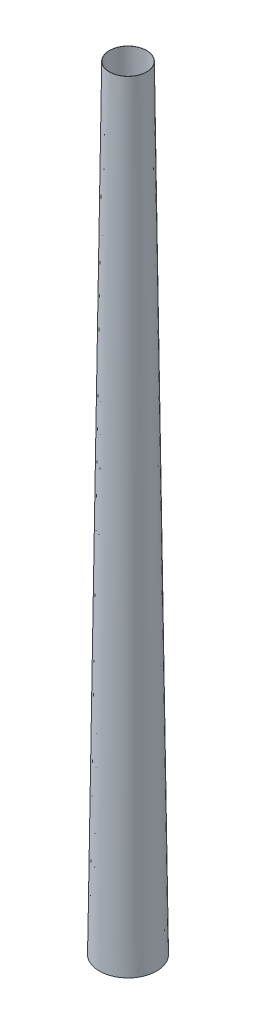
ISO-10303-21;
HEADER;
FILE_DESCRIPTION(('STEP AP214'),'2;1');
FILE_NAME('part.step','',(''),(''),'','','');
FILE_SCHEMA(('AUTOMOTIVE_DESIGN { 1 0 10303 214 1 1 1 1 }'));
ENDSEC;
DATA;
#1=APPLICATION_CONTEXT('core data for automotive mechanical design processes');
#2=APPLICATION_PROTOCOL_DEFINITION('international standard','automotive_design',2000,#1);
#3=PRODUCT_CONTEXT('',#1,'mechanical');
#4=PRODUCT('Part','Part','',(#3));
#5=PRODUCT_RELATED_PRODUCT_CATEGORY('part','',(#4));
#6=PRODUCT_DEFINITION_FORMATION('','',#4);
#7=PRODUCT_DEFINITION_CONTEXT('part definition',#1,'design');
#8=PRODUCT_DEFINITION('design','',#6,#7);
#9=PRODUCT_DEFINITION_SHAPE('','',#8);
#10=(LENGTH_UNIT() NAMED_UNIT(*) SI_UNIT(.MILLI.,.METRE.));
#11=(NAMED_UNIT(*) PLANE_ANGLE_UNIT() SI_UNIT($,.RADIAN.));
#12=(NAMED_UNIT(*) SI_UNIT($,.STERADIAN.) SOLID_ANGLE_UNIT());
#13=UNCERTAINTY_MEASURE_WITH_UNIT(LENGTH_MEASURE(1.E-05),#10,'distance_accuracy_value','');
#14=(GEOMETRIC_REPRESENTATION_CONTEXT(3) GLOBAL_UNCERTAINTY_ASSIGNED_CONTEXT((#13)) GLOBAL_UNIT_ASSIGNED_CONTEXT((#10,
#11,#12)) REPRESENTATION_CONTEXT('',''));
#15=CARTESIAN_POINT('',(0.,0.,0.));
#16=DIRECTION('',(0.,0.,1.));
#17=DIRECTION('',(1.,0.,0.));
#18=AXIS2_PLACEMENT_3D('',#15,#16,#17);
#19=CARTESIAN_POINT('',(0.,135000.,0.));
#20=DIRECTION('',(0.,-1.,0.));
#21=DIRECTION('',(0.,0.,-1.));
#22=AXIS2_PLACEMENT_3D('',#19,#20,#21);
#23=CONICAL_SURFACE('',#22,3230.,0.0128067072113191);
#24=CARTESIAN_POINT('',(0.,0.,0.));
#25=DIRECTION('',(0.,-1.,0.));
#26=DIRECTION('',(0.,0.,-1.));
#27=AXIS2_PLACEMENT_3D('',#24,#25,#26);
#28=CIRCLE('',#27,4959.);
#29=CARTESIAN_POINT('',(0.,0.,-4959.));
#30=VERTEX_POINT('',#29);
#31=EDGE_CURVE('E10',#30,#30,#28,.T.);
#32=ORIENTED_EDGE('',*,*,#31,.T.);
#33=EDGE_LOOP('',(#32));
#34=FACE_BOUND('',#33,.T.);
#35=CARTESIAN_POINT('',(0.,135000.,0.));
#36=DIRECTION('',(0.,-1.,0.));
#37=DIRECTION('',(0.,0.,-1.));
#38=AXIS2_PLACEMENT_3D('',#35,#36,#37);
#39=CIRCLE('',#38,3230.);
#40=CARTESIAN_POINT('',(0.,135000.,-3230.));
#41=VERTEX_POINT('',#40);
#42=EDGE_CURVE('E54',#41,#41,#39,.T.);
#43=ORIENTED_EDGE('',*,*,#42,.F.);
#44=EDGE_LOOP('',(#43));
#45=FACE_BOUND('',#44,.T.);
#46=ADVANCED_FACE('F37',(#34,#45),#23,.F.);
#47=CARTESIAN_POINT('',(4959.,0.,0.));
#48=DIRECTION('',(0.,-1.,0.));
#49=DIRECTION('',(0.,0.,-1.));
#50=AXIS2_PLACEMENT_3D('',#47,#48,#49);
#51=PLANE('',#50);
#52=CARTESIAN_POINT('',(0.,0.,0.));
#53=DIRECTION('',(0.,-1.,0.));
#54=DIRECTION('',(0.,0.,-1.));
#55=AXIS2_PLACEMENT_3D('',#52,#53,#54);
#56=CIRCLE('',#55,5000.);
#57=CARTESIAN_POINT('',(0.,0.,-5000.));
#58=VERTEX_POINT('',#57);
#59=EDGE_CURVE('E44',#58,#58,#56,.T.);
#60=ORIENTED_EDGE('',*,*,#59,.T.);
#61=EDGE_LOOP('',(#60));
#62=FACE_BOUND('',#61,.T.);
#63=ORIENTED_EDGE('',*,*,#31,.F.);
#64=EDGE_LOOP('',(#63));
#65=FACE_BOUND('',#64,.T.);
#66=ADVANCED_FACE('F65',(#62,#65),#51,.T.);
#67=CARTESIAN_POINT('',(0.,0.,0.));
#68=DIRECTION('',(0.,-1.,0.));
#69=DIRECTION('',(0.,0.,-1.));
#70=AXIS2_PLACEMENT_3D('',#67,#68,#69);
#71=CONICAL_SURFACE('',#70,5000.,0.012932612281353);
#72=CARTESIAN_POINT('',(0.,135000.,0.));
#73=DIRECTION('',(0.,-1.,0.));
#74=DIRECTION('',(0.,0.,-1.));
#75=AXIS2_PLACEMENT_3D('',#72,#73,#74);
#76=CIRCLE('',#75,3254.);
#77=CARTESIAN_POINT('',(0.,135000.,-3254.));
#78=VERTEX_POINT('',#77);
#79=EDGE_CURVE('E49',#78,#78,#76,.T.);
#80=ORIENTED_EDGE('',*,*,#79,.T.);
#81=EDGE_LOOP('',(#80));
#82=FACE_BOUND('',#81,.T.);
#83=ORIENTED_EDGE('',*,*,#59,.F.);
#84=EDGE_LOOP('',(#83));
#85=FACE_BOUND('',#84,.T.);
#86=ADVANCED_FACE('F69',(#82,#85),#71,.T.);
#87=CARTESIAN_POINT('',(3230.,135000.,0.));
#88=DIRECTION('',(0.,1.,0.));
#89=DIRECTION('',(0.,0.,1.));
#90=AXIS2_PLACEMENT_3D('',#87,#88,#89);
#91=PLANE('',#90);
#92=ORIENTED_EDGE('',*,*,#42,.T.);
#93=EDGE_LOOP('',(#92));
#94=FACE_BOUND('',#93,.T.);
#95=ORIENTED_EDGE('',*,*,#79,.F.);
#96=EDGE_LOOP('',(#95));
#97=FACE_BOUND('',#96,.T.);
#98=ADVANCED_FACE('F61',(#94,#97),#91,.T.);
#99=CLOSED_SHELL('',(#46,#66,#86,#98));
#100=MANIFOLD_SOLID_BREP('B2',#99);
#101=ADVANCED_BREP_SHAPE_REPRESENTATION('',(#18,#100),#14);
#102=SHAPE_DEFINITION_REPRESENTATION(#9,#101);
ENDSEC;
END-ISO-10303-21;
